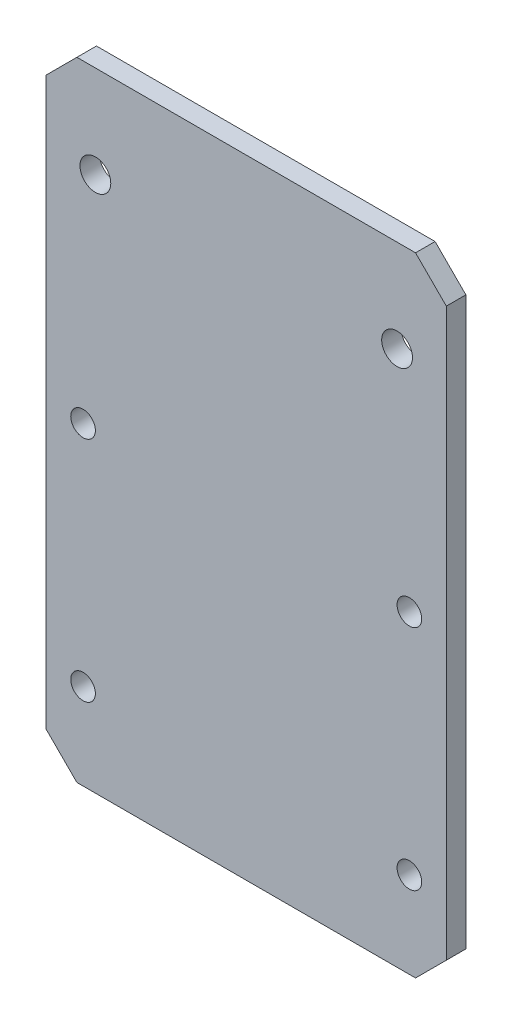
ISO-10303-21;
HEADER;
FILE_DESCRIPTION(('STEP AP214'),'2;1');
FILE_NAME('part.step','',(''),(''),'','','');
FILE_SCHEMA(('AUTOMOTIVE_DESIGN { 1 0 10303 214 1 1 1 1 }'));
ENDSEC;
DATA;
#1=APPLICATION_CONTEXT('core data for automotive mechanical design processes');
#2=APPLICATION_PROTOCOL_DEFINITION('international standard','automotive_design',2000,#1);
#3=PRODUCT_CONTEXT('',#1,'mechanical');
#4=PRODUCT('Part','Part','',(#3));
#5=PRODUCT_RELATED_PRODUCT_CATEGORY('part','',(#4));
#6=PRODUCT_DEFINITION_FORMATION('','',#4);
#7=PRODUCT_DEFINITION_CONTEXT('part definition',#1,'design');
#8=PRODUCT_DEFINITION('design','',#6,#7);
#9=PRODUCT_DEFINITION_SHAPE('','',#8);
#10=(LENGTH_UNIT() NAMED_UNIT(*) SI_UNIT(.MILLI.,.METRE.));
#11=(NAMED_UNIT(*) PLANE_ANGLE_UNIT() SI_UNIT($,.RADIAN.));
#12=(NAMED_UNIT(*) SI_UNIT($,.STERADIAN.) SOLID_ANGLE_UNIT());
#13=UNCERTAINTY_MEASURE_WITH_UNIT(LENGTH_MEASURE(1.E-05),#10,'distance_accuracy_value','');
#14=(GEOMETRIC_REPRESENTATION_CONTEXT(3) GLOBAL_UNCERTAINTY_ASSIGNED_CONTEXT((#13)) GLOBAL_UNIT_ASSIGNED_CONTEXT((#10,
#11,#12)) REPRESENTATION_CONTEXT('',''));
#15=CARTESIAN_POINT('',(0.,0.,0.));
#16=DIRECTION('',(0.,0.,1.));
#17=DIRECTION('',(1.,0.,0.));
#18=AXIS2_PLACEMENT_3D('',#15,#16,#17);
#19=CARTESIAN_POINT('',(0.,0.,3.175));
#20=DIRECTION('',(0.,0.,-1.));
#21=DIRECTION('',(-1.,0.,0.));
#22=AXIS2_PLACEMENT_3D('',#19,#20,#21);
#23=PLANE('',#22);
#24=DIRECTION('',(0.,-1.,0.));
#25=VECTOR('',#24,1.);
#26=CARTESIAN_POINT('',(-32.5,-51.,3.175));
#27=LINE('',#26,#25);
#28=CARTESIAN_POINT('',(-32.5,46.,3.175));
#29=VERTEX_POINT('',#28);
#30=CARTESIAN_POINT('',(-32.5,-46.,3.175));
#31=VERTEX_POINT('',#30);
#32=EDGE_CURVE('E175',#29,#31,#27,.T.);
#33=ORIENTED_EDGE('',*,*,#32,.T.);
#34=DIRECTION('',(-0.707106781186546,0.70710678118655,0.));
#35=VECTOR('',#34,1.);
#36=CARTESIAN_POINT('',(-27.5,-51.,3.175));
#37=LINE('',#36,#35);
#38=CARTESIAN_POINT('',(-27.5,-51.,3.175));
#39=VERTEX_POINT('',#38);
#40=EDGE_CURVE('E158',#31,#39,#37,.F.);
#41=ORIENTED_EDGE('',*,*,#40,.T.);
#42=DIRECTION('',(1.,0.,0.));
#43=VECTOR('',#42,1.);
#44=CARTESIAN_POINT('',(-32.5,-51.,3.175));
#45=LINE('',#44,#43);
#46=CARTESIAN_POINT('',(27.5,-51.,3.175));
#47=VERTEX_POINT('',#46);
#48=EDGE_CURVE('E129',#39,#47,#45,.T.);
#49=ORIENTED_EDGE('',*,*,#48,.T.);
#50=DIRECTION('',(-0.707106781186549,-0.707106781186547,0.));
#51=VECTOR('',#50,1.);
#52=CARTESIAN_POINT('',(32.5,-46.,3.175));
#53=LINE('',#52,#51);
#54=CARTESIAN_POINT('',(32.5,-46.,3.175));
#55=VERTEX_POINT('',#54);
#56=EDGE_CURVE('E156',#47,#55,#53,.F.);
#57=ORIENTED_EDGE('',*,*,#56,.T.);
#58=DIRECTION('',(0.,1.,0.));
#59=VECTOR('',#58,1.);
#60=CARTESIAN_POINT('',(32.5,-51.,3.175));
#61=LINE('',#60,#59);
#62=CARTESIAN_POINT('',(32.5,46.,3.175));
#63=VERTEX_POINT('',#62);
#64=EDGE_CURVE('E136',#55,#63,#61,.T.);
#65=ORIENTED_EDGE('',*,*,#64,.T.);
#66=DIRECTION('',(0.707106781186546,-0.707106781186549,0.));
#67=VECTOR('',#66,1.);
#68=CARTESIAN_POINT('',(27.5,51.,3.175));
#69=LINE('',#68,#67);
#70=CARTESIAN_POINT('',(27.5,51.,3.175));
#71=VERTEX_POINT('',#70);
#72=EDGE_CURVE('E64',#63,#71,#69,.F.);
#73=ORIENTED_EDGE('',*,*,#72,.T.);
#74=DIRECTION('',(-1.,0.,0.));
#75=VECTOR('',#74,1.);
#76=CARTESIAN_POINT('',(-32.5,51.,3.175));
#77=LINE('',#76,#75);
#78=CARTESIAN_POINT('',(-27.5,51.,3.175));
#79=VERTEX_POINT('',#78);
#80=EDGE_CURVE('E139',#71,#79,#77,.T.);
#81=ORIENTED_EDGE('',*,*,#80,.T.);
#82=DIRECTION('',(0.70710678118655,0.707106781186546,0.));
#83=VECTOR('',#82,1.);
#84=CARTESIAN_POINT('',(-32.5,46.,3.175));
#85=LINE('',#84,#83);
#86=EDGE_CURVE('E154',#79,#29,#85,.F.);
#87=ORIENTED_EDGE('',*,*,#86,.T.);
#88=EDGE_LOOP('',(#33,#41,#49,#57,#65,#73,#81,#87));
#89=FACE_BOUND('',#88,.T.);
#90=CARTESIAN_POINT('',(-24.5,36.,3.175));
#91=DIRECTION('',(0.,0.,1.));
#92=DIRECTION('',(1.,0.,0.));
#93=AXIS2_PLACEMENT_3D('',#90,#91,#92);
#94=CIRCLE('',#93,2.5);
#95=CARTESIAN_POINT('',(-22.,36.,3.175));
#96=VERTEX_POINT('',#95);
#97=EDGE_CURVE('E171',#96,#96,#94,.T.);
#98=ORIENTED_EDGE('',*,*,#97,.F.);
#99=EDGE_LOOP('',(#98));
#100=FACE_BOUND('',#99,.T.);
#101=CARTESIAN_POINT('',(24.5,36.,3.175));
#102=DIRECTION('',(0.,0.,1.));
#103=DIRECTION('',(1.,0.,0.));
#104=AXIS2_PLACEMENT_3D('',#101,#102,#103);
#105=CIRCLE('',#104,2.5);
#106=CARTESIAN_POINT('',(27.,36.,3.175));
#107=VERTEX_POINT('',#106);
#108=EDGE_CURVE('E182',#107,#107,#105,.T.);
#109=ORIENTED_EDGE('',*,*,#108,.F.);
#110=EDGE_LOOP('',(#109));
#111=FACE_BOUND('',#110,.T.);
#112=CARTESIAN_POINT('',(26.5,0.,3.175));
#113=DIRECTION('',(0.,0.,1.));
#114=DIRECTION('',(1.,0.,0.));
#115=AXIS2_PLACEMENT_3D('',#112,#113,#114);
#116=CIRCLE('',#115,2.);
#117=CARTESIAN_POINT('',(28.5,0.,3.175));
#118=VERTEX_POINT('',#117);
#119=EDGE_CURVE('E188',#118,#118,#116,.T.);
#120=ORIENTED_EDGE('',*,*,#119,.F.);
#121=EDGE_LOOP('',(#120));
#122=FACE_BOUND('',#121,.T.);
#123=CARTESIAN_POINT('',(-26.5,0.,3.175));
#124=DIRECTION('',(0.,0.,1.));
#125=DIRECTION('',(-1.,0.,0.));
#126=AXIS2_PLACEMENT_3D('',#123,#124,#125);
#127=CIRCLE('',#126,2.);
#128=CARTESIAN_POINT('',(-28.5,0.,3.175));
#129=VERTEX_POINT('',#128);
#130=EDGE_CURVE('E194',#129,#129,#127,.T.);
#131=ORIENTED_EDGE('',*,*,#130,.F.);
#132=EDGE_LOOP('',(#131));
#133=FACE_BOUND('',#132,.T.);
#134=CARTESIAN_POINT('',(-26.4999999999999,-37.,3.175));
#135=DIRECTION('',(0.,0.,1.));
#136=DIRECTION('',(1.,0.,0.));
#137=AXIS2_PLACEMENT_3D('',#134,#135,#136);
#138=CIRCLE('',#137,2.00000000000001);
#139=CARTESIAN_POINT('',(-24.4999999999999,-37.,3.175));
#140=VERTEX_POINT('',#139);
#141=EDGE_CURVE('E200',#140,#140,#138,.T.);
#142=ORIENTED_EDGE('',*,*,#141,.F.);
#143=EDGE_LOOP('',(#142));
#144=FACE_BOUND('',#143,.T.);
#145=CARTESIAN_POINT('',(26.5,-37.,3.175));
#146=DIRECTION('',(0.,0.,1.));
#147=DIRECTION('',(-1.,0.,0.));
#148=AXIS2_PLACEMENT_3D('',#145,#146,#147);
#149=CIRCLE('',#148,2.00000000000001);
#150=CARTESIAN_POINT('',(24.5,-37.,3.175));
#151=VERTEX_POINT('',#150);
#152=EDGE_CURVE('E206',#151,#151,#149,.T.);
#153=ORIENTED_EDGE('',*,*,#152,.F.);
#154=EDGE_LOOP('',(#153));
#155=FACE_BOUND('',#154,.T.);
#156=ADVANCED_FACE('F44',(#89,#100,#111,#122,#133,#144,#155),#23,.F.);
#157=CARTESIAN_POINT('',(0.,0.,0.));
#158=DIRECTION('',(0.,0.,-1.));
#159=DIRECTION('',(-1.,0.,0.));
#160=AXIS2_PLACEMENT_3D('',#157,#158,#159);
#161=PLANE('',#160);
#162=CARTESIAN_POINT('',(-26.4999999999999,-37.,0.));
#163=DIRECTION('',(0.,0.,1.));
#164=DIRECTION('',(1.,0.,0.));
#165=AXIS2_PLACEMENT_3D('',#162,#163,#164);
#166=CIRCLE('',#165,2.00000000000001);
#167=CARTESIAN_POINT('',(-24.4999999999999,-37.,0.));
#168=VERTEX_POINT('',#167);
#169=EDGE_CURVE('E203',#168,#168,#166,.T.);
#170=ORIENTED_EDGE('',*,*,#169,.T.);
#171=EDGE_LOOP('',(#170));
#172=FACE_BOUND('',#171,.T.);
#173=CARTESIAN_POINT('',(26.5,0.,0.));
#174=DIRECTION('',(0.,0.,1.));
#175=DIRECTION('',(1.,0.,0.));
#176=AXIS2_PLACEMENT_3D('',#173,#174,#175);
#177=CIRCLE('',#176,2.);
#178=CARTESIAN_POINT('',(28.5,0.,0.));
#179=VERTEX_POINT('',#178);
#180=EDGE_CURVE('E191',#179,#179,#177,.T.);
#181=ORIENTED_EDGE('',*,*,#180,.T.);
#182=EDGE_LOOP('',(#181));
#183=FACE_BOUND('',#182,.T.);
#184=CARTESIAN_POINT('',(-24.5,36.,0.));
#185=DIRECTION('',(0.,0.,1.));
#186=DIRECTION('',(1.,0.,0.));
#187=AXIS2_PLACEMENT_3D('',#184,#185,#186);
#188=CIRCLE('',#187,2.5);
#189=CARTESIAN_POINT('',(-22.,36.,0.));
#190=VERTEX_POINT('',#189);
#191=EDGE_CURVE('E179',#190,#190,#188,.T.);
#192=ORIENTED_EDGE('',*,*,#191,.T.);
#193=EDGE_LOOP('',(#192));
#194=FACE_BOUND('',#193,.T.);
#195=DIRECTION('',(1.,0.,0.));
#196=VECTOR('',#195,1.);
#197=CARTESIAN_POINT('',(-32.5,-51.,0.));
#198=LINE('',#197,#196);
#199=CARTESIAN_POINT('',(-27.5,-51.,0.));
#200=VERTEX_POINT('',#199);
#201=CARTESIAN_POINT('',(27.5,-51.,0.));
#202=VERTEX_POINT('',#201);
#203=EDGE_CURVE('E126',#200,#202,#198,.T.);
#204=ORIENTED_EDGE('',*,*,#203,.F.);
#205=DIRECTION('',(0.707106781186546,-0.70710678118655,0.));
#206=VECTOR('',#205,1.);
#207=CARTESIAN_POINT('',(-39.2500000000001,-39.2499999999999,0.));
#208=LINE('',#207,#206);
#209=CARTESIAN_POINT('',(-32.5,-46.,0.));
#210=VERTEX_POINT('',#209);
#211=EDGE_CURVE('E109',#200,#210,#208,.F.);
#212=ORIENTED_EDGE('',*,*,#211,.T.);
#213=DIRECTION('',(0.,-1.,0.));
#214=VECTOR('',#213,1.);
#215=CARTESIAN_POINT('',(-32.5,-51.,0.));
#216=LINE('',#215,#214);
#217=CARTESIAN_POINT('',(-32.5,46.,0.));
#218=VERTEX_POINT('',#217);
#219=EDGE_CURVE('E137',#218,#210,#216,.T.);
#220=ORIENTED_EDGE('',*,*,#219,.F.);
#221=DIRECTION('',(-0.70710678118655,-0.707106781186546,0.));
#222=VECTOR('',#221,1.);
#223=CARTESIAN_POINT('',(-39.2499999999999,39.2500000000001,0.));
#224=LINE('',#223,#222);
#225=CARTESIAN_POINT('',(-27.5,51.,0.));
#226=VERTEX_POINT('',#225);
#227=EDGE_CURVE('E147',#218,#226,#224,.F.);
#228=ORIENTED_EDGE('',*,*,#227,.T.);
#229=DIRECTION('',(-1.,0.,0.));
#230=VECTOR('',#229,1.);
#231=CARTESIAN_POINT('',(-32.5,51.,0.));
#232=LINE('',#231,#230);
#233=CARTESIAN_POINT('',(27.5,51.,0.));
#234=VERTEX_POINT('',#233);
#235=EDGE_CURVE('E141',#234,#226,#232,.T.);
#236=ORIENTED_EDGE('',*,*,#235,.F.);
#237=DIRECTION('',(-0.707106781186546,0.707106781186549,0.));
#238=VECTOR('',#237,1.);
#239=CARTESIAN_POINT('',(39.25,39.2499999999999,0.));
#240=LINE('',#239,#238);
#241=CARTESIAN_POINT('',(32.5,46.,0.));
#242=VERTEX_POINT('',#241);
#243=EDGE_CURVE('E130',#234,#242,#240,.F.);
#244=ORIENTED_EDGE('',*,*,#243,.T.);
#245=DIRECTION('',(0.,1.,0.));
#246=VECTOR('',#245,1.);
#247=CARTESIAN_POINT('',(32.5,-51.,0.));
#248=LINE('',#247,#246);
#249=CARTESIAN_POINT('',(32.5,-46.,0.));
#250=VERTEX_POINT('',#249);
#251=EDGE_CURVE('E170',#250,#242,#248,.T.);
#252=ORIENTED_EDGE('',*,*,#251,.F.);
#253=DIRECTION('',(0.707106781186549,0.707106781186547,0.));
#254=VECTOR('',#253,1.);
#255=CARTESIAN_POINT('',(39.2499999999999,-39.25,0.));
#256=LINE('',#255,#254);
#257=EDGE_CURVE('E120',#250,#202,#256,.F.);
#258=ORIENTED_EDGE('',*,*,#257,.T.);
#259=EDGE_LOOP('',(#204,#212,#220,#228,#236,#244,#252,#258));
#260=FACE_BOUND('',#259,.T.);
#261=CARTESIAN_POINT('',(24.5,36.,0.));
#262=DIRECTION('',(0.,0.,1.));
#263=DIRECTION('',(1.,0.,0.));
#264=AXIS2_PLACEMENT_3D('',#261,#262,#263);
#265=CIRCLE('',#264,2.5);
#266=CARTESIAN_POINT('',(27.,36.,0.));
#267=VERTEX_POINT('',#266);
#268=EDGE_CURVE('E185',#267,#267,#265,.T.);
#269=ORIENTED_EDGE('',*,*,#268,.T.);
#270=EDGE_LOOP('',(#269));
#271=FACE_BOUND('',#270,.T.);
#272=CARTESIAN_POINT('',(-26.5,0.,0.));
#273=DIRECTION('',(0.,0.,1.));
#274=DIRECTION('',(-1.,0.,0.));
#275=AXIS2_PLACEMENT_3D('',#272,#273,#274);
#276=CIRCLE('',#275,2.);
#277=CARTESIAN_POINT('',(-28.5,0.,0.));
#278=VERTEX_POINT('',#277);
#279=EDGE_CURVE('E197',#278,#278,#276,.T.);
#280=ORIENTED_EDGE('',*,*,#279,.T.);
#281=EDGE_LOOP('',(#280));
#282=FACE_BOUND('',#281,.T.);
#283=CARTESIAN_POINT('',(26.5,-37.,0.));
#284=DIRECTION('',(0.,0.,1.));
#285=DIRECTION('',(-1.,0.,0.));
#286=AXIS2_PLACEMENT_3D('',#283,#284,#285);
#287=CIRCLE('',#286,2.00000000000001);
#288=CARTESIAN_POINT('',(24.5,-37.,0.));
#289=VERTEX_POINT('',#288);
#290=EDGE_CURVE('E209',#289,#289,#287,.T.);
#291=ORIENTED_EDGE('',*,*,#290,.T.);
#292=EDGE_LOOP('',(#291));
#293=FACE_BOUND('',#292,.T.);
#294=ADVANCED_FACE('F133',(#172,#183,#194,#260,#271,#282,#293),#161,.T.);
#295=CARTESIAN_POINT('',(32.5,-51.,3.175));
#296=DIRECTION('',(-1.,0.,0.));
#297=DIRECTION('',(0.,-1.,0.));
#298=AXIS2_PLACEMENT_3D('',#295,#296,#297);
#299=PLANE('',#298);
#300=ORIENTED_EDGE('',*,*,#64,.F.);
#301=DIRECTION('',(0.,0.,-1.));
#302=VECTOR('',#301,1.);
#303=CARTESIAN_POINT('',(32.5,-46.,3.175));
#304=LINE('',#303,#302);
#305=EDGE_CURVE('E162',#55,#250,#304,.T.);
#306=ORIENTED_EDGE('',*,*,#305,.T.);
#307=ORIENTED_EDGE('',*,*,#251,.T.);
#308=DIRECTION('',(0.,0.,1.));
#309=VECTOR('',#308,1.);
#310=CARTESIAN_POINT('',(32.5,46.,3.175));
#311=LINE('',#310,#309);
#312=EDGE_CURVE('E160',#242,#63,#311,.T.);
#313=ORIENTED_EDGE('',*,*,#312,.T.);
#314=EDGE_LOOP('',(#300,#306,#307,#313));
#315=FACE_BOUND('',#314,.T.);
#316=ADVANCED_FACE('F223',(#315),#299,.F.);
#317=CARTESIAN_POINT('',(-32.5,51.,3.175));
#318=DIRECTION('',(0.,-1.,0.));
#319=DIRECTION('',(1.,0.,0.));
#320=AXIS2_PLACEMENT_3D('',#317,#318,#319);
#321=PLANE('',#320);
#322=ORIENTED_EDGE('',*,*,#235,.T.);
#323=DIRECTION('',(0.,0.,1.));
#324=VECTOR('',#323,1.);
#325=CARTESIAN_POINT('',(-27.5,51.,3.175));
#326=LINE('',#325,#324);
#327=EDGE_CURVE('E13',#226,#79,#326,.T.);
#328=ORIENTED_EDGE('',*,*,#327,.T.);
#329=ORIENTED_EDGE('',*,*,#80,.F.);
#330=DIRECTION('',(0.,0.,-1.));
#331=VECTOR('',#330,1.);
#332=CARTESIAN_POINT('',(27.5,51.,3.175));
#333=LINE('',#332,#331);
#334=EDGE_CURVE('E52',#71,#234,#333,.T.);
#335=ORIENTED_EDGE('',*,*,#334,.T.);
#336=EDGE_LOOP('',(#322,#328,#329,#335));
#337=FACE_BOUND('',#336,.T.);
#338=ADVANCED_FACE('F167',(#337),#321,.F.);
#339=CARTESIAN_POINT('',(-32.5,-51.,3.175));
#340=DIRECTION('',(1.,0.,0.));
#341=DIRECTION('',(0.,1.,0.));
#342=AXIS2_PLACEMENT_3D('',#339,#340,#341);
#343=PLANE('',#342);
#344=ORIENTED_EDGE('',*,*,#219,.T.);
#345=DIRECTION('',(0.,0.,1.));
#346=VECTOR('',#345,1.);
#347=CARTESIAN_POINT('',(-32.5,-46.,3.175));
#348=LINE('',#347,#346);
#349=EDGE_CURVE('E114',#210,#31,#348,.T.);
#350=ORIENTED_EDGE('',*,*,#349,.T.);
#351=ORIENTED_EDGE('',*,*,#32,.F.);
#352=DIRECTION('',(0.,0.,-1.));
#353=VECTOR('',#352,1.);
#354=CARTESIAN_POINT('',(-32.5,46.,3.175));
#355=LINE('',#354,#353);
#356=EDGE_CURVE('E119',#29,#218,#355,.T.);
#357=ORIENTED_EDGE('',*,*,#356,.T.);
#358=EDGE_LOOP('',(#344,#350,#351,#357));
#359=FACE_BOUND('',#358,.T.);
#360=ADVANCED_FACE('F233',(#359),#343,.F.);
#361=CARTESIAN_POINT('',(-32.5,-51.,3.175));
#362=DIRECTION('',(0.,1.,0.));
#363=DIRECTION('',(-1.,0.,0.));
#364=AXIS2_PLACEMENT_3D('',#361,#362,#363);
#365=PLANE('',#364);
#366=ORIENTED_EDGE('',*,*,#48,.F.);
#367=DIRECTION('',(0.,0.,-1.));
#368=VECTOR('',#367,1.);
#369=CARTESIAN_POINT('',(-27.5,-51.,3.175));
#370=LINE('',#369,#368);
#371=EDGE_CURVE('E113',#39,#200,#370,.T.);
#372=ORIENTED_EDGE('',*,*,#371,.T.);
#373=ORIENTED_EDGE('',*,*,#203,.T.);
#374=DIRECTION('',(0.,0.,1.));
#375=VECTOR('',#374,1.);
#376=CARTESIAN_POINT('',(27.5,-51.,3.175));
#377=LINE('',#376,#375);
#378=EDGE_CURVE('E131',#202,#47,#377,.T.);
#379=ORIENTED_EDGE('',*,*,#378,.T.);
#380=EDGE_LOOP('',(#366,#372,#373,#379));
#381=FACE_BOUND('',#380,.T.);
#382=ADVANCED_FACE('F125',(#381),#365,.F.);
#383=CARTESIAN_POINT('',(-24.5,36.,3.175));
#384=DIRECTION('',(0.,0.,-1.));
#385=DIRECTION('',(-1.,0.,0.));
#386=AXIS2_PLACEMENT_3D('',#383,#384,#385);
#387=CYLINDRICAL_SURFACE('',#386,2.5);
#388=ORIENTED_EDGE('',*,*,#97,.T.);
#389=EDGE_LOOP('',(#388));
#390=FACE_BOUND('',#389,.T.);
#391=ORIENTED_EDGE('',*,*,#191,.F.);
#392=EDGE_LOOP('',(#391));
#393=FACE_BOUND('',#392,.T.);
#394=ADVANCED_FACE('F228',(#390,#393),#387,.F.);
#395=CARTESIAN_POINT('',(24.5,36.,3.175));
#396=DIRECTION('',(0.,0.,-1.));
#397=DIRECTION('',(-1.,0.,0.));
#398=AXIS2_PLACEMENT_3D('',#395,#396,#397);
#399=CYLINDRICAL_SURFACE('',#398,2.5);
#400=ORIENTED_EDGE('',*,*,#108,.T.);
#401=EDGE_LOOP('',(#400));
#402=FACE_BOUND('',#401,.T.);
#403=ORIENTED_EDGE('',*,*,#268,.F.);
#404=EDGE_LOOP('',(#403));
#405=FACE_BOUND('',#404,.T.);
#406=ADVANCED_FACE('F352',(#402,#405),#399,.F.);
#407=CARTESIAN_POINT('',(26.5,0.,3.175));
#408=DIRECTION('',(0.,0.,-1.));
#409=DIRECTION('',(-1.,0.,0.));
#410=AXIS2_PLACEMENT_3D('',#407,#408,#409);
#411=CYLINDRICAL_SURFACE('',#410,2.);
#412=ORIENTED_EDGE('',*,*,#119,.T.);
#413=EDGE_LOOP('',(#412));
#414=FACE_BOUND('',#413,.T.);
#415=ORIENTED_EDGE('',*,*,#180,.F.);
#416=EDGE_LOOP('',(#415));
#417=FACE_BOUND('',#416,.T.);
#418=ADVANCED_FACE('F342',(#414,#417),#411,.F.);
#419=CARTESIAN_POINT('',(-26.5,0.,3.175));
#420=DIRECTION('',(0.,0.,-1.));
#421=DIRECTION('',(-1.,0.,0.));
#422=AXIS2_PLACEMENT_3D('',#419,#420,#421);
#423=CYLINDRICAL_SURFACE('',#422,2.);
#424=ORIENTED_EDGE('',*,*,#130,.T.);
#425=EDGE_LOOP('',(#424));
#426=FACE_BOUND('',#425,.T.);
#427=ORIENTED_EDGE('',*,*,#279,.F.);
#428=EDGE_LOOP('',(#427));
#429=FACE_BOUND('',#428,.T.);
#430=ADVANCED_FACE('F332',(#426,#429),#423,.F.);
#431=CARTESIAN_POINT('',(-26.4999999999999,-37.,3.175));
#432=DIRECTION('',(0.,0.,-1.));
#433=DIRECTION('',(-1.,0.,0.));
#434=AXIS2_PLACEMENT_3D('',#431,#432,#433);
#435=CYLINDRICAL_SURFACE('',#434,2.00000000000001);
#436=ORIENTED_EDGE('',*,*,#141,.T.);
#437=EDGE_LOOP('',(#436));
#438=FACE_BOUND('',#437,.T.);
#439=ORIENTED_EDGE('',*,*,#169,.F.);
#440=EDGE_LOOP('',(#439));
#441=FACE_BOUND('',#440,.T.);
#442=ADVANCED_FACE('F323',(#438,#441),#435,.F.);
#443=CARTESIAN_POINT('',(26.5,-37.,3.175));
#444=DIRECTION('',(0.,0.,-1.));
#445=DIRECTION('',(-1.,0.,0.));
#446=AXIS2_PLACEMENT_3D('',#443,#444,#445);
#447=CYLINDRICAL_SURFACE('',#446,2.00000000000001);
#448=ORIENTED_EDGE('',*,*,#152,.T.);
#449=EDGE_LOOP('',(#448));
#450=FACE_BOUND('',#449,.T.);
#451=ORIENTED_EDGE('',*,*,#290,.F.);
#452=EDGE_LOOP('',(#451));
#453=FACE_BOUND('',#452,.T.);
#454=ADVANCED_FACE('F215',(#450,#453),#447,.F.);
#455=CARTESIAN_POINT('',(-27.5,-51.,3.175));
#456=DIRECTION('',(0.707106781186549,0.707106781186545,0.));
#457=DIRECTION('',(0.,0.,-1.));
#458=AXIS2_PLACEMENT_3D('',#455,#456,#457);
#459=PLANE('',#458);
#460=ORIENTED_EDGE('',*,*,#40,.F.);
#461=ORIENTED_EDGE('',*,*,#349,.F.);
#462=ORIENTED_EDGE('',*,*,#211,.F.);
#463=ORIENTED_EDGE('',*,*,#371,.F.);
#464=EDGE_LOOP('',(#460,#461,#462,#463));
#465=FACE_BOUND('',#464,.T.);
#466=ADVANCED_FACE('F112',(#465),#459,.F.);
#467=CARTESIAN_POINT('',(32.5,-46.,3.175));
#468=DIRECTION('',(-0.707106781186546,0.707106781186548,0.));
#469=DIRECTION('',(0.,0.,-1.));
#470=AXIS2_PLACEMENT_3D('',#467,#468,#469);
#471=PLANE('',#470);
#472=ORIENTED_EDGE('',*,*,#56,.F.);
#473=ORIENTED_EDGE('',*,*,#378,.F.);
#474=ORIENTED_EDGE('',*,*,#257,.F.);
#475=ORIENTED_EDGE('',*,*,#305,.F.);
#476=EDGE_LOOP('',(#472,#473,#474,#475));
#477=FACE_BOUND('',#476,.T.);
#478=ADVANCED_FACE('F244',(#477),#471,.F.);
#479=CARTESIAN_POINT('',(-32.5,46.,3.175));
#480=DIRECTION('',(0.707106781186545,-0.707106781186549,0.));
#481=DIRECTION('',(0.,0.,-1.));
#482=AXIS2_PLACEMENT_3D('',#479,#480,#481);
#483=PLANE('',#482);
#484=ORIENTED_EDGE('',*,*,#86,.F.);
#485=ORIENTED_EDGE('',*,*,#327,.F.);
#486=ORIENTED_EDGE('',*,*,#227,.F.);
#487=ORIENTED_EDGE('',*,*,#356,.F.);
#488=EDGE_LOOP('',(#484,#485,#486,#487));
#489=FACE_BOUND('',#488,.T.);
#490=ADVANCED_FACE('F246',(#489),#483,.F.);
#491=CARTESIAN_POINT('',(27.5,51.,3.175));
#492=DIRECTION('',(-0.707106781186549,-0.707106781186546,0.));
#493=DIRECTION('',(0.,0.,-1.));
#494=AXIS2_PLACEMENT_3D('',#491,#492,#493);
#495=PLANE('',#494);
#496=ORIENTED_EDGE('',*,*,#72,.F.);
#497=ORIENTED_EDGE('',*,*,#312,.F.);
#498=ORIENTED_EDGE('',*,*,#243,.F.);
#499=ORIENTED_EDGE('',*,*,#334,.F.);
#500=EDGE_LOOP('',(#496,#497,#498,#499));
#501=FACE_BOUND('',#500,.T.);
#502=ADVANCED_FACE('F46',(#501),#495,.F.);
#503=CLOSED_SHELL('',(#156,#294,#316,#338,#360,#382,#394,#406,#418,#430,#442,#454,#466,#478,
#490,#502));
#504=MANIFOLD_SOLID_BREP('B2',#503);
#505=ADVANCED_BREP_SHAPE_REPRESENTATION('',(#18,#504),#14);
#506=SHAPE_DEFINITION_REPRESENTATION(#9,#505);
ENDSEC;
END-ISO-10303-21;
